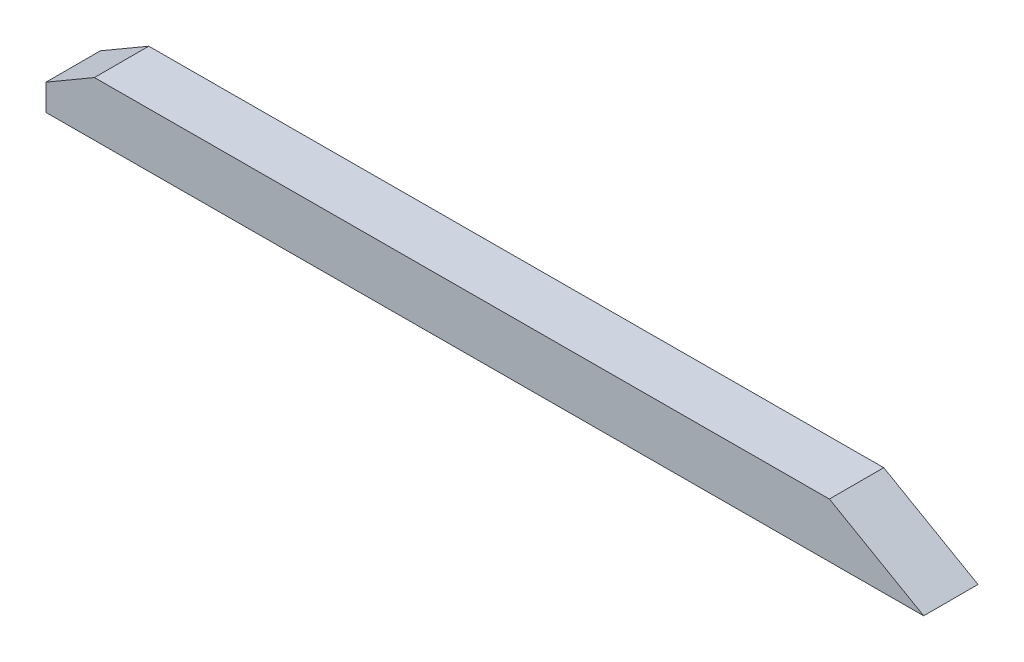
ISO-10303-21;
HEADER;
FILE_DESCRIPTION(('STEP AP214'),'2;1');
FILE_NAME('part.step','',(''),(''),'','','');
FILE_SCHEMA(('AUTOMOTIVE_DESIGN { 1 0 10303 214 1 1 1 1 }'));
ENDSEC;
DATA;
#1=APPLICATION_CONTEXT('core data for automotive mechanical design processes');
#2=APPLICATION_PROTOCOL_DEFINITION('international standard','automotive_design',2000,#1);
#3=PRODUCT_CONTEXT('',#1,'mechanical');
#4=PRODUCT('Part','Part','',(#3));
#5=PRODUCT_RELATED_PRODUCT_CATEGORY('part','',(#4));
#6=PRODUCT_DEFINITION_FORMATION('','',#4);
#7=PRODUCT_DEFINITION_CONTEXT('part definition',#1,'design');
#8=PRODUCT_DEFINITION('design','',#6,#7);
#9=PRODUCT_DEFINITION_SHAPE('','',#8);
#10=(LENGTH_UNIT() NAMED_UNIT(*) SI_UNIT(.MILLI.,.METRE.));
#11=(NAMED_UNIT(*) PLANE_ANGLE_UNIT() SI_UNIT($,.RADIAN.));
#12=(NAMED_UNIT(*) SI_UNIT($,.STERADIAN.) SOLID_ANGLE_UNIT());
#13=UNCERTAINTY_MEASURE_WITH_UNIT(LENGTH_MEASURE(1.E-05),#10,'distance_accuracy_value','');
#14=(GEOMETRIC_REPRESENTATION_CONTEXT(3) GLOBAL_UNCERTAINTY_ASSIGNED_CONTEXT((#13)) GLOBAL_UNIT_ASSIGNED_CONTEXT((#10,
#11,#12)) REPRESENTATION_CONTEXT('',''));
#15=CARTESIAN_POINT('',(0.,0.,0.));
#16=DIRECTION('',(0.,0.,1.));
#17=DIRECTION('',(1.,0.,0.));
#18=AXIS2_PLACEMENT_3D('',#15,#16,#17);
#19=CARTESIAN_POINT('',(-363.113744253307,20.3071536670027,20.));
#20=DIRECTION('',(0.503433423192775,-0.864034020402209,0.));
#21=DIRECTION('',(0.864034020402209,0.503433423192775,0.));
#22=AXIS2_PLACEMENT_3D('',#19,#20,#21);
#23=PLANE('',#22);
#24=DIRECTION('',(-0.864034020402209,-0.503433423192775,0.));
#25=VECTOR('',#24,1.);
#26=CARTESIAN_POINT('',(-363.113744253307,20.3071536670027,0.));
#27=LINE('',#26,#25);
#28=CARTESIAN_POINT('',(-345.281644436147,30.697109203116,0.));
#29=VERTEX_POINT('',#28);
#30=CARTESIAN_POINT('',(-363.113744253307,20.3071536670027,0.));
#31=VERTEX_POINT('',#30);
#32=EDGE_CURVE('E107',#29,#31,#27,.T.);
#33=ORIENTED_EDGE('',*,*,#32,.T.);
#34=DIRECTION('',(0.,0.,-1.));
#35=VECTOR('',#34,1.);
#36=CARTESIAN_POINT('',(-363.113744253307,20.3071536670027,20.));
#37=LINE('',#36,#35);
#38=CARTESIAN_POINT('',(-363.113744253307,20.3071536670027,20.));
#39=VERTEX_POINT('',#38);
#40=EDGE_CURVE('E11',#39,#31,#37,.T.);
#41=ORIENTED_EDGE('',*,*,#40,.F.);
#42=DIRECTION('',(-0.864034020402209,-0.503433423192775,0.));
#43=VECTOR('',#42,1.);
#44=CARTESIAN_POINT('',(-363.113744253307,20.3071536670027,20.));
#45=LINE('',#44,#43);
#46=CARTESIAN_POINT('',(-345.281644436147,30.697109203116,20.));
#47=VERTEX_POINT('',#46);
#48=EDGE_CURVE('E115',#47,#39,#45,.T.);
#49=ORIENTED_EDGE('',*,*,#48,.F.);
#50=DIRECTION('',(0.,0.,-1.));
#51=VECTOR('',#50,1.);
#52=CARTESIAN_POINT('',(-345.281644436147,30.697109203116,20.));
#53=LINE('',#52,#51);
#54=EDGE_CURVE('E103',#47,#29,#53,.T.);
#55=ORIENTED_EDGE('',*,*,#54,.T.);
#56=EDGE_LOOP('',(#33,#41,#49,#55));
#57=FACE_BOUND('',#56,.T.);
#58=ADVANCED_FACE('F33',(#57),#23,.F.);
#59=CARTESIAN_POINT('',(-363.113744253307,10.6371536670027,20.));
#60=DIRECTION('',(1.,0.,0.));
#61=DIRECTION('',(0.,0.,-1.));
#62=AXIS2_PLACEMENT_3D('',#59,#60,#61);
#63=PLANE('',#62);
#64=DIRECTION('',(0.,-1.,0.));
#65=VECTOR('',#64,1.);
#66=CARTESIAN_POINT('',(-363.113744253307,10.6371536670027,0.));
#67=LINE('',#66,#65);
#68=CARTESIAN_POINT('',(-363.113744253307,10.6371536670027,0.));
#69=VERTEX_POINT('',#68);
#70=EDGE_CURVE('E110',#31,#69,#67,.T.);
#71=ORIENTED_EDGE('',*,*,#70,.T.);
#72=DIRECTION('',(0.,0.,-1.));
#73=VECTOR('',#72,1.);
#74=CARTESIAN_POINT('',(-363.113744253307,10.6371536670027,20.));
#75=LINE('',#74,#73);
#76=CARTESIAN_POINT('',(-363.113744253307,10.6371536670027,20.));
#77=VERTEX_POINT('',#76);
#78=EDGE_CURVE('E41',#77,#69,#75,.T.);
#79=ORIENTED_EDGE('',*,*,#78,.F.);
#80=DIRECTION('',(0.,-1.,0.));
#81=VECTOR('',#80,1.);
#82=CARTESIAN_POINT('',(-363.113744253307,10.6371536670027,20.));
#83=LINE('',#82,#81);
#84=EDGE_CURVE('E83',#39,#77,#83,.T.);
#85=ORIENTED_EDGE('',*,*,#84,.F.);
#86=ORIENTED_EDGE('',*,*,#40,.T.);
#87=EDGE_LOOP('',(#71,#79,#85,#86));
#88=FACE_BOUND('',#87,.T.);
#89=ADVANCED_FACE('F134',(#88),#63,.F.);
#90=CARTESIAN_POINT('',(-363.113744253307,10.6371536670027,20.));
#91=DIRECTION('',(-0.00335589071250041,0.999994368982909,0.));
#92=DIRECTION('',(-0.999994368982909,-0.00335589071250041,0.));
#93=AXIS2_PLACEMENT_3D('',#90,#91,#92);
#94=PLANE('',#93);
#95=DIRECTION('',(0.999994368982909,0.00335589071250041,0.));
#96=VECTOR('',#95,1.);
#97=CARTESIAN_POINT('',(-363.113744253307,10.6371536670027,0.));
#98=LINE('',#97,#96);
#99=CARTESIAN_POINT('',(-39.953744253307,11.7216494164685,0.));
#100=VERTEX_POINT('',#99);
#101=EDGE_CURVE('E98',#69,#100,#98,.T.);
#102=ORIENTED_EDGE('',*,*,#101,.T.);
#103=DIRECTION('',(0.,0.,-1.));
#104=VECTOR('',#103,1.);
#105=CARTESIAN_POINT('',(-39.953744253307,11.7216494164685,20.));
#106=LINE('',#105,#104);
#107=CARTESIAN_POINT('',(-39.953744253307,11.7216494164685,20.));
#108=VERTEX_POINT('',#107);
#109=EDGE_CURVE('E95',#108,#100,#106,.T.);
#110=ORIENTED_EDGE('',*,*,#109,.F.);
#111=DIRECTION('',(0.999994368982909,0.00335589071250041,0.));
#112=VECTOR('',#111,1.);
#113=CARTESIAN_POINT('',(-363.113744253307,10.6371536670027,20.));
#114=LINE('',#113,#112);
#115=EDGE_CURVE('E87',#77,#108,#114,.T.);
#116=ORIENTED_EDGE('',*,*,#115,.F.);
#117=ORIENTED_EDGE('',*,*,#78,.T.);
#118=EDGE_LOOP('',(#102,#110,#116,#117));
#119=FACE_BOUND('',#118,.T.);
#120=ADVANCED_FACE('F96',(#119),#94,.F.);
#121=CARTESIAN_POINT('',(-74.661644436147,31.6052854616889,20.));
#122=DIRECTION('',(-0.497091317836003,-0.867698231951677,0.));
#123=DIRECTION('',(0.867698231951677,-0.497091317836003,0.));
#124=AXIS2_PLACEMENT_3D('',#121,#122,#123);
#125=PLANE('',#124);
#126=DIRECTION('',(-0.867698231951677,0.497091317836003,0.));
#127=VECTOR('',#126,1.);
#128=CARTESIAN_POINT('',(-74.661644436147,31.6052854616889,0.));
#129=LINE('',#128,#127);
#130=CARTESIAN_POINT('',(-74.661644436147,31.6052854616889,0.));
#131=VERTEX_POINT('',#130);
#132=EDGE_CURVE('E69',#100,#131,#129,.T.);
#133=ORIENTED_EDGE('',*,*,#132,.T.);
#134=DIRECTION('',(0.,0.,-1.));
#135=VECTOR('',#134,1.);
#136=CARTESIAN_POINT('',(-74.661644436147,31.6052854616889,20.));
#137=LINE('',#136,#135);
#138=CARTESIAN_POINT('',(-74.661644436147,31.6052854616889,20.));
#139=VERTEX_POINT('',#138);
#140=EDGE_CURVE('E99',#139,#131,#137,.T.);
#141=ORIENTED_EDGE('',*,*,#140,.F.);
#142=DIRECTION('',(-0.867698231951677,0.497091317836003,0.));
#143=VECTOR('',#142,1.);
#144=CARTESIAN_POINT('',(-74.661644436147,31.6052854616889,20.));
#145=LINE('',#144,#143);
#146=EDGE_CURVE('E91',#108,#139,#145,.T.);
#147=ORIENTED_EDGE('',*,*,#146,.F.);
#148=ORIENTED_EDGE('',*,*,#109,.T.);
#149=EDGE_LOOP('',(#133,#141,#147,#148));
#150=FACE_BOUND('',#149,.T.);
#151=ADVANCED_FACE('F101',(#150),#125,.F.);
#152=CARTESIAN_POINT('',(-345.281644436147,30.697109203116,20.));
#153=DIRECTION('',(0.00335589071250041,-0.999994368982909,0.));
#154=DIRECTION('',(0.999994368982909,0.00335589071250041,0.));
#155=AXIS2_PLACEMENT_3D('',#152,#153,#154);
#156=PLANE('',#155);
#157=DIRECTION('',(-0.999994368982909,-0.00335589071250041,0.));
#158=VECTOR('',#157,1.);
#159=CARTESIAN_POINT('',(-345.281644436147,30.697109203116,0.));
#160=LINE('',#159,#158);
#161=EDGE_CURVE('E75',#131,#29,#160,.T.);
#162=ORIENTED_EDGE('',*,*,#161,.T.);
#163=ORIENTED_EDGE('',*,*,#54,.F.);
#164=DIRECTION('',(-0.999994368982909,-0.00335589071250041,0.));
#165=VECTOR('',#164,1.);
#166=CARTESIAN_POINT('',(-345.281644436147,30.697109203116,20.));
#167=LINE('',#166,#165);
#168=EDGE_CURVE('E49',#139,#47,#167,.T.);
#169=ORIENTED_EDGE('',*,*,#168,.F.);
#170=ORIENTED_EDGE('',*,*,#140,.T.);
#171=EDGE_LOOP('',(#162,#163,#169,#170));
#172=FACE_BOUND('',#171,.T.);
#173=ADVANCED_FACE('F123',(#172),#156,.F.);
#174=CARTESIAN_POINT('',(0.,0.,20.));
#175=DIRECTION('',(0.,0.,-1.));
#176=DIRECTION('',(-1.,0.,0.));
#177=AXIS2_PLACEMENT_3D('',#174,#175,#176);
#178=PLANE('',#177);
#179=ORIENTED_EDGE('',*,*,#48,.T.);
#180=ORIENTED_EDGE('',*,*,#84,.T.);
#181=ORIENTED_EDGE('',*,*,#115,.T.);
#182=ORIENTED_EDGE('',*,*,#146,.T.);
#183=ORIENTED_EDGE('',*,*,#168,.T.);
#184=EDGE_LOOP('',(#179,#180,#181,#182,#183));
#185=FACE_BOUND('',#184,.T.);
#186=ADVANCED_FACE('F89',(#185),#178,.F.);
#187=CARTESIAN_POINT('',(0.,0.,0.));
#188=DIRECTION('',(0.,0.,-1.));
#189=DIRECTION('',(-1.,0.,0.));
#190=AXIS2_PLACEMENT_3D('',#187,#188,#189);
#191=PLANE('',#190);
#192=ORIENTED_EDGE('',*,*,#32,.F.);
#193=ORIENTED_EDGE('',*,*,#161,.F.);
#194=ORIENTED_EDGE('',*,*,#132,.F.);
#195=ORIENTED_EDGE('',*,*,#101,.F.);
#196=ORIENTED_EDGE('',*,*,#70,.F.);
#197=EDGE_LOOP('',(#192,#193,#194,#195,#196));
#198=FACE_BOUND('',#197,.T.);
#199=ADVANCED_FACE('F119',(#198),#191,.T.);
#200=CLOSED_SHELL('',(#58,#89,#120,#151,#173,#186,#199));
#201=MANIFOLD_SOLID_BREP('B2',#200);
#202=ADVANCED_BREP_SHAPE_REPRESENTATION('',(#18,#201),#14);
#203=SHAPE_DEFINITION_REPRESENTATION(#9,#202);
ENDSEC;
END-ISO-10303-21;
